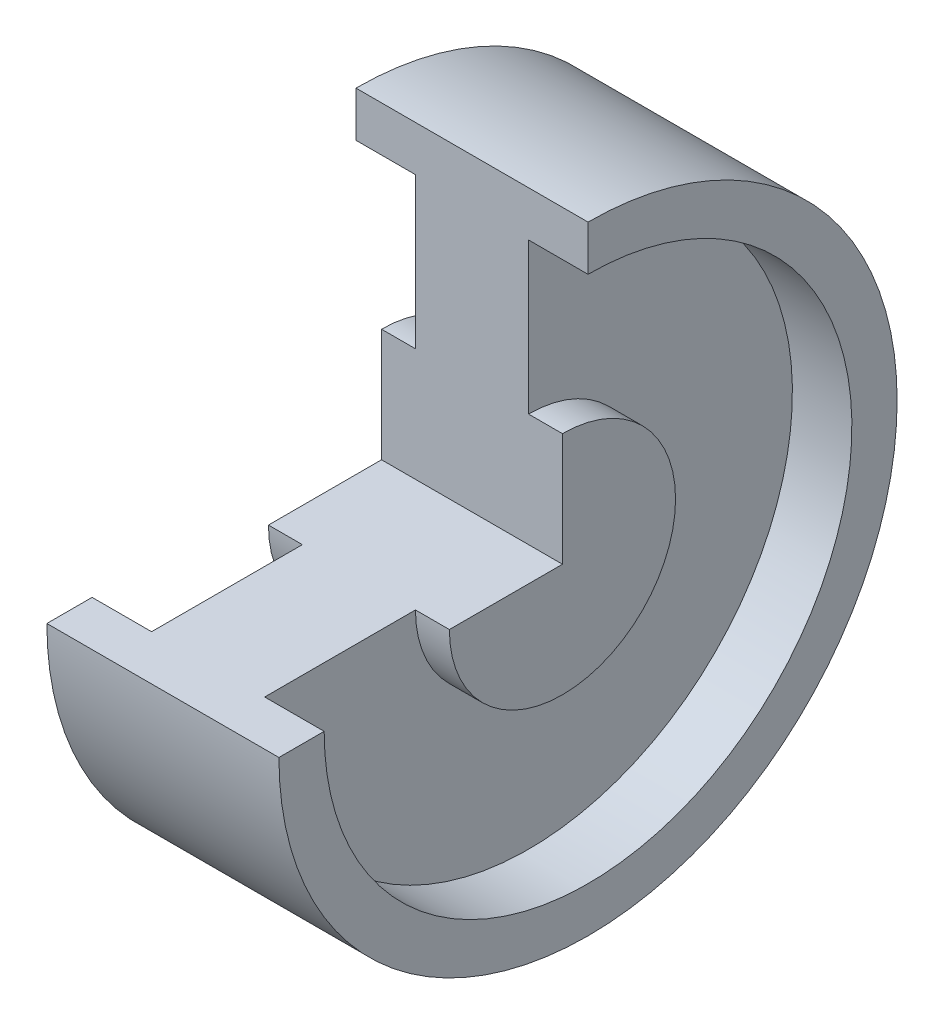
ISO-10303-21;
HEADER;
FILE_DESCRIPTION(('STEP AP214'),'2;1');
FILE_NAME('part.step','',(''),(''),'','','');
FILE_SCHEMA(('AUTOMOTIVE_DESIGN { 1 0 10303 214 1 1 1 1 }'));
ENDSEC;
DATA;
#1=APPLICATION_CONTEXT('core data for automotive mechanical design processes');
#2=APPLICATION_PROTOCOL_DEFINITION('international standard','automotive_design',2000,#1);
#3=PRODUCT_CONTEXT('',#1,'mechanical');
#4=PRODUCT('Part','Part','',(#3));
#5=PRODUCT_RELATED_PRODUCT_CATEGORY('part','',(#4));
#6=PRODUCT_DEFINITION_FORMATION('','',#4);
#7=PRODUCT_DEFINITION_CONTEXT('part definition',#1,'design');
#8=PRODUCT_DEFINITION('design','',#6,#7);
#9=PRODUCT_DEFINITION_SHAPE('','',#8);
#10=(LENGTH_UNIT() NAMED_UNIT(*) SI_UNIT(.MILLI.,.METRE.));
#11=(NAMED_UNIT(*) PLANE_ANGLE_UNIT() SI_UNIT($,.RADIAN.));
#12=(NAMED_UNIT(*) SI_UNIT($,.STERADIAN.) SOLID_ANGLE_UNIT());
#13=UNCERTAINTY_MEASURE_WITH_UNIT(LENGTH_MEASURE(1.E-05),#10,'distance_accuracy_value','');
#14=(GEOMETRIC_REPRESENTATION_CONTEXT(3) GLOBAL_UNCERTAINTY_ASSIGNED_CONTEXT((#13)) GLOBAL_UNIT_ASSIGNED_CONTEXT((#10,
#11,#12)) REPRESENTATION_CONTEXT('',''));
#15=CARTESIAN_POINT('',(0.,0.,0.));
#16=DIRECTION('',(0.,0.,1.));
#17=DIRECTION('',(1.,0.,0.));
#18=AXIS2_PLACEMENT_3D('',#15,#16,#17);
#19=CARTESIAN_POINT('',(31.872847051539,-14.0322601294251,82.));
#20=DIRECTION('',(1.,0.,0.));
#21=DIRECTION('',(0.,1.,0.));
#22=AXIS2_PLACEMENT_3D('',#19,#20,#21);
#23=PLANE('',#22);
#24=CARTESIAN_POINT('',(31.872847051539,-14.032260129426,0.));
#25=DIRECTION('',(1.,0.,0.));
#26=DIRECTION('',(0.,1.,0.));
#27=AXIS2_PLACEMENT_3D('',#24,#25,#26);
#28=CIRCLE('',#27,70.);
#29=CARTESIAN_POINT('',(31.872847051539,-14.0322601294252,70.));
#30=VERTEX_POINT('',#29);
#31=CARTESIAN_POINT('',(31.8728470515389,55.9677398705741,0.));
#32=VERTEX_POINT('',#31);
#33=EDGE_CURVE('E11',#30,#32,#28,.T.);
#34=ORIENTED_EDGE('',*,*,#33,.F.);
#35=DIRECTION('',(0.,0.,1.));
#36=VECTOR('',#35,1.);
#37=CARTESIAN_POINT('',(31.872847051539,-14.0322601294251,82.));
#38=LINE('',#37,#36);
#39=CARTESIAN_POINT('',(31.872847051539,-14.0322601294251,82.));
#40=VERTEX_POINT('',#39);
#41=EDGE_CURVE('E122',#30,#40,#38,.T.);
#42=ORIENTED_EDGE('',*,*,#41,.T.);
#43=CARTESIAN_POINT('',(31.872847051539,-14.032260129426,0.));
#44=DIRECTION('',(1.,0.,0.));
#45=DIRECTION('',(0.,1.,0.));
#46=AXIS2_PLACEMENT_3D('',#43,#44,#45);
#47=CIRCLE('',#46,82.);
#48=CARTESIAN_POINT('',(31.8728470515389,67.9677398705741,0.));
#49=VERTEX_POINT('',#48);
#50=EDGE_CURVE('E117',#40,#49,#47,.T.);
#51=ORIENTED_EDGE('',*,*,#50,.T.);
#52=DIRECTION('',(0.,1.,0.));
#53=VECTOR('',#52,1.);
#54=CARTESIAN_POINT('',(31.8728470515389,67.9677398705741,0.));
#55=LINE('',#54,#53);
#56=EDGE_CURVE('E120',#32,#49,#55,.T.);
#57=ORIENTED_EDGE('',*,*,#56,.F.);
#58=EDGE_LOOP('',(#34,#42,#51,#57));
#59=FACE_BOUND('',#58,.T.);
#60=ADVANCED_FACE('F39',(#59),#23,.T.);
#61=CARTESIAN_POINT('',(25.0922987473726,-14.032260129426,0.));
#62=DIRECTION('',(1.,0.,0.));
#63=DIRECTION('',(0.,1.,0.));
#64=AXIS2_PLACEMENT_3D('',#61,#62,#63);
#65=CYLINDRICAL_SURFACE('',#64,70.);
#66=CARTESIAN_POINT('',(16.0922987473726,-14.032260129426,0.));
#67=DIRECTION('',(1.,0.,0.));
#68=DIRECTION('',(0.,1.,0.));
#69=AXIS2_PLACEMENT_3D('',#66,#67,#68);
#70=CIRCLE('',#69,70.);
#71=CARTESIAN_POINT('',(16.0922987473726,-14.0322601294252,70.));
#72=VERTEX_POINT('',#71);
#73=CARTESIAN_POINT('',(16.0922987473726,55.967739870574,0.));
#74=VERTEX_POINT('',#73);
#75=EDGE_CURVE('E47',#72,#74,#70,.T.);
#76=ORIENTED_EDGE('',*,*,#75,.F.);
#77=DIRECTION('',(1.,0.,0.));
#78=VECTOR('',#77,1.);
#79=CARTESIAN_POINT('',(31.872847051539,-14.0322601294252,70.));
#80=LINE('',#79,#78);
#81=EDGE_CURVE('E127',#72,#30,#80,.T.);
#82=ORIENTED_EDGE('',*,*,#81,.T.);
#83=ORIENTED_EDGE('',*,*,#33,.T.);
#84=DIRECTION('',(1.,0.,0.));
#85=VECTOR('',#84,1.);
#86=CARTESIAN_POINT('',(31.8728470515389,55.9677398705741,0.));
#87=LINE('',#86,#85);
#88=EDGE_CURVE('E140',#74,#32,#87,.T.);
#89=ORIENTED_EDGE('',*,*,#88,.F.);
#90=EDGE_LOOP('',(#76,#82,#83,#89));
#91=FACE_BOUND('',#90,.T.);
#92=ADVANCED_FACE('F41',(#91),#65,.F.);
#93=CARTESIAN_POINT('',(16.0922987473726,-14.0322601294252,70.));
#94=DIRECTION('',(1.,0.,0.));
#95=DIRECTION('',(0.,1.,0.));
#96=AXIS2_PLACEMENT_3D('',#93,#94,#95);
#97=PLANE('',#96);
#98=CARTESIAN_POINT('',(16.0922987473726,-14.032260129426,0.));
#99=DIRECTION('',(1.,0.,0.));
#100=DIRECTION('',(0.,1.,0.));
#101=AXIS2_PLACEMENT_3D('',#98,#99,#100);
#102=CIRCLE('',#101,30.);
#103=CARTESIAN_POINT('',(16.0922987473726,-14.0322601294256,30.));
#104=VERTEX_POINT('',#103);
#105=CARTESIAN_POINT('',(16.0922987473726,15.967739870574,0.));
#106=VERTEX_POINT('',#105);
#107=EDGE_CURVE('E205',#104,#106,#102,.T.);
#108=ORIENTED_EDGE('',*,*,#107,.F.);
#109=DIRECTION('',(0.,0.,1.));
#110=VECTOR('',#109,1.);
#111=CARTESIAN_POINT('',(16.0922987473726,-14.0322601294252,70.));
#112=LINE('',#111,#110);
#113=EDGE_CURVE('E191',#104,#72,#112,.T.);
#114=ORIENTED_EDGE('',*,*,#113,.T.);
#115=ORIENTED_EDGE('',*,*,#75,.T.);
#116=DIRECTION('',(0.,1.,0.));
#117=VECTOR('',#116,1.);
#118=CARTESIAN_POINT('',(16.0922987473726,55.967739870574,0.));
#119=LINE('',#118,#117);
#120=EDGE_CURVE('E161',#106,#74,#119,.T.);
#121=ORIENTED_EDGE('',*,*,#120,.F.);
#122=EDGE_LOOP('',(#108,#114,#115,#121));
#123=FACE_BOUND('',#122,.T.);
#124=ADVANCED_FACE('F208',(#123),#97,.T.);
#125=CARTESIAN_POINT('',(25.0922987473726,-14.032260129426,0.));
#126=DIRECTION('',(1.,0.,0.));
#127=DIRECTION('',(0.,1.,0.));
#128=AXIS2_PLACEMENT_3D('',#125,#126,#127);
#129=CYLINDRICAL_SURFACE('',#128,30.);
#130=CARTESIAN_POINT('',(25.0922987473726,-14.032260129426,0.));
#131=DIRECTION('',(1.,0.,0.));
#132=DIRECTION('',(0.,1.,0.));
#133=AXIS2_PLACEMENT_3D('',#130,#131,#132);
#134=CIRCLE('',#133,30.);
#135=CARTESIAN_POINT('',(25.0922987473726,-14.0322601294256,30.));
#136=VERTEX_POINT('',#135);
#137=CARTESIAN_POINT('',(25.0922987473726,15.967739870574,0.));
#138=VERTEX_POINT('',#137);
#139=EDGE_CURVE('E203',#136,#138,#134,.T.);
#140=ORIENTED_EDGE('',*,*,#139,.F.);
#141=DIRECTION('',(-1.,0.,0.));
#142=VECTOR('',#141,1.);
#143=CARTESIAN_POINT('',(16.0922987473726,-14.0322601294256,30.));
#144=LINE('',#143,#142);
#145=EDGE_CURVE('E188',#136,#104,#144,.T.);
#146=ORIENTED_EDGE('',*,*,#145,.T.);
#147=ORIENTED_EDGE('',*,*,#107,.T.);
#148=DIRECTION('',(-1.,0.,0.));
#149=VECTOR('',#148,1.);
#150=CARTESIAN_POINT('',(16.0922987473726,15.967739870574,0.));
#151=LINE('',#150,#149);
#152=EDGE_CURVE('E158',#138,#106,#151,.T.);
#153=ORIENTED_EDGE('',*,*,#152,.F.);
#154=EDGE_LOOP('',(#140,#146,#147,#153));
#155=FACE_BOUND('',#154,.T.);
#156=ADVANCED_FACE('F239',(#155),#129,.T.);
#157=CARTESIAN_POINT('',(25.0922987473726,-14.0322601294256,30.));
#158=DIRECTION('',(1.,0.,0.));
#159=DIRECTION('',(0.,1.,0.));
#160=AXIS2_PLACEMENT_3D('',#157,#158,#159);
#161=PLANE('',#160);
#162=DIRECTION('',(0.,1.,0.));
#163=VECTOR('',#162,1.);
#164=CARTESIAN_POINT('',(25.0922987473726,15.967739870574,0.));
#165=LINE('',#164,#163);
#166=CARTESIAN_POINT('',(25.0922987473726,-14.032260129426,0.));
#167=VERTEX_POINT('',#166);
#168=EDGE_CURVE('E155',#167,#138,#165,.T.);
#169=ORIENTED_EDGE('',*,*,#168,.F.);
#170=DIRECTION('',(0.,0.,1.));
#171=VECTOR('',#170,1.);
#172=CARTESIAN_POINT('',(25.0922987473726,-14.0322601294256,30.));
#173=LINE('',#172,#171);
#174=EDGE_CURVE('E185',#167,#136,#173,.T.);
#175=ORIENTED_EDGE('',*,*,#174,.T.);
#176=ORIENTED_EDGE('',*,*,#139,.T.);
#177=EDGE_LOOP('',(#169,#175,#176));
#178=FACE_BOUND('',#177,.T.);
#179=ADVANCED_FACE('F237',(#178),#161,.T.);
#180=CARTESIAN_POINT('',(-22.9077012526274,-14.0322601294256,30.));
#181=DIRECTION('',(-1.,0.,0.));
#182=DIRECTION('',(0.,-1.,0.));
#183=AXIS2_PLACEMENT_3D('',#180,#181,#182);
#184=PLANE('',#183);
#185=CARTESIAN_POINT('',(-22.9077012526274,-14.032260129426,0.));
#186=DIRECTION('',(1.,0.,0.));
#187=DIRECTION('',(0.,1.,0.));
#188=AXIS2_PLACEMENT_3D('',#185,#186,#187);
#189=CIRCLE('',#188,30.);
#190=CARTESIAN_POINT('',(-22.9077012526274,-14.0322601294256,30.));
#191=VERTEX_POINT('',#190);
#192=CARTESIAN_POINT('',(-22.9077012526274,15.967739870574,0.));
#193=VERTEX_POINT('',#192);
#194=EDGE_CURVE('E201',#191,#193,#189,.T.);
#195=ORIENTED_EDGE('',*,*,#194,.F.);
#196=DIRECTION('',(0.,0.,-1.));
#197=VECTOR('',#196,1.);
#198=CARTESIAN_POINT('',(-22.9077012526274,-14.0322601294256,30.));
#199=LINE('',#198,#197);
#200=CARTESIAN_POINT('',(-22.9077012526274,-14.032260129426,0.));
#201=VERTEX_POINT('',#200);
#202=EDGE_CURVE('E179',#191,#201,#199,.T.);
#203=ORIENTED_EDGE('',*,*,#202,.T.);
#204=DIRECTION('',(0.,-1.,0.));
#205=VECTOR('',#204,1.);
#206=CARTESIAN_POINT('',(-22.9077012526274,15.967739870574,0.));
#207=LINE('',#206,#205);
#208=EDGE_CURVE('E153',#193,#201,#207,.T.);
#209=ORIENTED_EDGE('',*,*,#208,.F.);
#210=EDGE_LOOP('',(#195,#203,#209));
#211=FACE_BOUND('',#210,.T.);
#212=ADVANCED_FACE('F232',(#211),#184,.T.);
#213=CARTESIAN_POINT('',(25.0922987473726,-14.032260129426,0.));
#214=DIRECTION('',(1.,0.,0.));
#215=DIRECTION('',(0.,1.,0.));
#216=AXIS2_PLACEMENT_3D('',#213,#214,#215);
#217=CYLINDRICAL_SURFACE('',#216,30.);
#218=CARTESIAN_POINT('',(-13.9077012526274,-14.032260129426,0.));
#219=DIRECTION('',(1.,0.,0.));
#220=DIRECTION('',(0.,1.,0.));
#221=AXIS2_PLACEMENT_3D('',#218,#219,#220);
#222=CIRCLE('',#221,30.);
#223=CARTESIAN_POINT('',(-13.9077012526274,-14.0322601294256,30.));
#224=VERTEX_POINT('',#223);
#225=CARTESIAN_POINT('',(-13.9077012526274,15.967739870574,0.));
#226=VERTEX_POINT('',#225);
#227=EDGE_CURVE('E199',#224,#226,#222,.T.);
#228=ORIENTED_EDGE('',*,*,#227,.F.);
#229=DIRECTION('',(-1.,0.,0.));
#230=VECTOR('',#229,1.);
#231=CARTESIAN_POINT('',(-13.9077012526274,-14.0322601294256,30.));
#232=LINE('',#231,#230);
#233=EDGE_CURVE('E176',#224,#191,#232,.T.);
#234=ORIENTED_EDGE('',*,*,#233,.T.);
#235=ORIENTED_EDGE('',*,*,#194,.T.);
#236=DIRECTION('',(-1.,0.,0.));
#237=VECTOR('',#236,1.);
#238=CARTESIAN_POINT('',(-13.9077012526274,15.967739870574,0.));
#239=LINE('',#238,#237);
#240=EDGE_CURVE('E150',#226,#193,#239,.T.);
#241=ORIENTED_EDGE('',*,*,#240,.F.);
#242=EDGE_LOOP('',(#228,#234,#235,#241));
#243=FACE_BOUND('',#242,.T.);
#244=ADVANCED_FACE('F229',(#243),#217,.T.);
#245=CARTESIAN_POINT('',(-13.9077012526274,-14.0322601294252,70.));
#246=DIRECTION('',(-1.,0.,0.));
#247=DIRECTION('',(0.,-1.,0.));
#248=AXIS2_PLACEMENT_3D('',#245,#246,#247);
#249=PLANE('',#248);
#250=CARTESIAN_POINT('',(-13.9077012526274,-14.032260129426,0.));
#251=DIRECTION('',(1.,0.,0.));
#252=DIRECTION('',(0.,1.,0.));
#253=AXIS2_PLACEMENT_3D('',#250,#251,#252);
#254=CIRCLE('',#253,70.);
#255=CARTESIAN_POINT('',(-13.9077012526274,-14.0322601294252,70.));
#256=VERTEX_POINT('',#255);
#257=CARTESIAN_POINT('',(-13.9077012526274,55.967739870574,0.));
#258=VERTEX_POINT('',#257);
#259=EDGE_CURVE('E197',#256,#258,#254,.T.);
#260=ORIENTED_EDGE('',*,*,#259,.F.);
#261=DIRECTION('',(0.,0.,-1.));
#262=VECTOR('',#261,1.);
#263=CARTESIAN_POINT('',(-13.9077012526274,-14.0322601294252,70.));
#264=LINE('',#263,#262);
#265=EDGE_CURVE('E173',#256,#224,#264,.T.);
#266=ORIENTED_EDGE('',*,*,#265,.T.);
#267=ORIENTED_EDGE('',*,*,#227,.T.);
#268=DIRECTION('',(0.,-1.,0.));
#269=VECTOR('',#268,1.);
#270=CARTESIAN_POINT('',(-13.9077012526274,55.967739870574,0.));
#271=LINE('',#270,#269);
#272=EDGE_CURVE('E147',#258,#226,#271,.T.);
#273=ORIENTED_EDGE('',*,*,#272,.F.);
#274=EDGE_LOOP('',(#260,#266,#267,#273));
#275=FACE_BOUND('',#274,.T.);
#276=ADVANCED_FACE('F224',(#275),#249,.T.);
#277=CARTESIAN_POINT('',(25.0922987473726,-14.032260129426,0.));
#278=DIRECTION('',(1.,0.,0.));
#279=DIRECTION('',(0.,1.,0.));
#280=AXIS2_PLACEMENT_3D('',#277,#278,#279);
#281=CYLINDRICAL_SURFACE('',#280,70.);
#282=CARTESIAN_POINT('',(-29.6882495567937,-14.032260129426,0.));
#283=DIRECTION('',(1.,0.,0.));
#284=DIRECTION('',(0.,1.,0.));
#285=AXIS2_PLACEMENT_3D('',#282,#283,#284);
#286=CIRCLE('',#285,70.);
#287=CARTESIAN_POINT('',(-29.6882495567937,-14.0322601294252,70.));
#288=VERTEX_POINT('',#287);
#289=CARTESIAN_POINT('',(-29.6882495567937,55.967739870574,0.));
#290=VERTEX_POINT('',#289);
#291=EDGE_CURVE('E195',#288,#290,#286,.T.);
#292=ORIENTED_EDGE('',*,*,#291,.F.);
#293=DIRECTION('',(1.,0.,0.));
#294=VECTOR('',#293,1.);
#295=CARTESIAN_POINT('',(-29.6882495567937,-14.0322601294252,70.));
#296=LINE('',#295,#294);
#297=EDGE_CURVE('E170',#288,#256,#296,.T.);
#298=ORIENTED_EDGE('',*,*,#297,.T.);
#299=ORIENTED_EDGE('',*,*,#259,.T.);
#300=DIRECTION('',(1.,0.,0.));
#301=VECTOR('',#300,1.);
#302=CARTESIAN_POINT('',(-29.6882495567937,55.967739870574,0.));
#303=LINE('',#302,#301);
#304=EDGE_CURVE('E144',#290,#258,#303,.T.);
#305=ORIENTED_EDGE('',*,*,#304,.F.);
#306=EDGE_LOOP('',(#292,#298,#299,#305));
#307=FACE_BOUND('',#306,.T.);
#308=ADVANCED_FACE('F222',(#307),#281,.F.);
#309=CARTESIAN_POINT('',(-29.6882495567937,-14.0322601294251,82.));
#310=DIRECTION('',(-1.,0.,0.));
#311=DIRECTION('',(0.,-1.,0.));
#312=AXIS2_PLACEMENT_3D('',#309,#310,#311);
#313=PLANE('',#312);
#314=CARTESIAN_POINT('',(-29.6882495567937,-14.032260129426,0.));
#315=DIRECTION('',(1.,0.,0.));
#316=DIRECTION('',(0.,1.,0.));
#317=AXIS2_PLACEMENT_3D('',#314,#315,#316);
#318=CIRCLE('',#317,82.);
#319=CARTESIAN_POINT('',(-29.6882495567937,-14.0322601294251,82.));
#320=VERTEX_POINT('',#319);
#321=CARTESIAN_POINT('',(-29.6882495567937,67.967739870574,0.));
#322=VERTEX_POINT('',#321);
#323=EDGE_CURVE('E126',#320,#322,#318,.T.);
#324=ORIENTED_EDGE('',*,*,#323,.F.);
#325=DIRECTION('',(0.,0.,-1.));
#326=VECTOR('',#325,1.);
#327=CARTESIAN_POINT('',(-29.6882495567937,-14.0322601294251,82.));
#328=LINE('',#327,#326);
#329=EDGE_CURVE('E167',#320,#288,#328,.T.);
#330=ORIENTED_EDGE('',*,*,#329,.T.);
#331=ORIENTED_EDGE('',*,*,#291,.T.);
#332=DIRECTION('',(0.,-1.,0.));
#333=VECTOR('',#332,1.);
#334=CARTESIAN_POINT('',(-29.6882495567937,67.967739870574,0.));
#335=LINE('',#334,#333);
#336=EDGE_CURVE('E135',#322,#290,#335,.T.);
#337=ORIENTED_EDGE('',*,*,#336,.F.);
#338=EDGE_LOOP('',(#324,#330,#331,#337));
#339=FACE_BOUND('',#338,.T.);
#340=ADVANCED_FACE('F218',(#339),#313,.T.);
#341=CARTESIAN_POINT('',(25.0922987473726,-14.032260129426,0.));
#342=DIRECTION('',(1.,0.,0.));
#343=DIRECTION('',(0.,1.,0.));
#344=AXIS2_PLACEMENT_3D('',#341,#342,#343);
#345=CYLINDRICAL_SURFACE('',#344,82.);
#346=DIRECTION('',(-1.,0.,0.));
#347=VECTOR('',#346,1.);
#348=CARTESIAN_POINT('',(-29.6882495567937,-14.0322601294251,82.));
#349=LINE('',#348,#347);
#350=EDGE_CURVE('E165',#40,#320,#349,.T.);
#351=ORIENTED_EDGE('',*,*,#350,.T.);
#352=ORIENTED_EDGE('',*,*,#323,.T.);
#353=DIRECTION('',(-1.,0.,0.));
#354=VECTOR('',#353,1.);
#355=CARTESIAN_POINT('',(-29.6882495567937,67.967739870574,0.));
#356=LINE('',#355,#354);
#357=EDGE_CURVE('E130',#49,#322,#356,.T.);
#358=ORIENTED_EDGE('',*,*,#357,.F.);
#359=ORIENTED_EDGE('',*,*,#50,.F.);
#360=EDGE_LOOP('',(#351,#352,#358,#359));
#361=FACE_BOUND('',#360,.T.);
#362=ADVANCED_FACE('F131',(#361),#345,.T.);
#363=CARTESIAN_POINT('',(0.,-14.0322601294258,14.032260129426));
#364=DIRECTION('',(0.,1.,0.));
#365=DIRECTION('',(-1.,0.,0.));
#366=AXIS2_PLACEMENT_3D('',#363,#364,#365);
#367=PLANE('',#366);
#368=ORIENTED_EDGE('',*,*,#41,.F.);
#369=ORIENTED_EDGE('',*,*,#81,.F.);
#370=ORIENTED_EDGE('',*,*,#113,.F.);
#371=ORIENTED_EDGE('',*,*,#145,.F.);
#372=ORIENTED_EDGE('',*,*,#174,.F.);
#373=DIRECTION('',(1.,0.,0.));
#374=VECTOR('',#373,1.);
#375=CARTESIAN_POINT('',(25.0922987473726,-14.032260129426,0.));
#376=LINE('',#375,#374);
#377=EDGE_CURVE('E182',#201,#167,#376,.T.);
#378=ORIENTED_EDGE('',*,*,#377,.F.);
#379=ORIENTED_EDGE('',*,*,#202,.F.);
#380=ORIENTED_EDGE('',*,*,#233,.F.);
#381=ORIENTED_EDGE('',*,*,#265,.F.);
#382=ORIENTED_EDGE('',*,*,#297,.F.);
#383=ORIENTED_EDGE('',*,*,#329,.F.);
#384=ORIENTED_EDGE('',*,*,#350,.F.);
#385=EDGE_LOOP('',(#368,#369,#370,#371,#372,#378,#379,#380,#381,#382,#383,#384));
#386=FACE_BOUND('',#385,.T.);
#387=ADVANCED_FACE('F213',(#386),#367,.T.);
#388=CARTESIAN_POINT('',(0.,0.,0.));
#389=DIRECTION('',(0.,0.,-1.));
#390=DIRECTION('',(-1.,0.,0.));
#391=AXIS2_PLACEMENT_3D('',#388,#389,#390);
#392=PLANE('',#391);
#393=ORIENTED_EDGE('',*,*,#56,.T.);
#394=ORIENTED_EDGE('',*,*,#357,.T.);
#395=ORIENTED_EDGE('',*,*,#336,.T.);
#396=ORIENTED_EDGE('',*,*,#304,.T.);
#397=ORIENTED_EDGE('',*,*,#272,.T.);
#398=ORIENTED_EDGE('',*,*,#240,.T.);
#399=ORIENTED_EDGE('',*,*,#208,.T.);
#400=ORIENTED_EDGE('',*,*,#377,.T.);
#401=ORIENTED_EDGE('',*,*,#168,.T.);
#402=ORIENTED_EDGE('',*,*,#152,.T.);
#403=ORIENTED_EDGE('',*,*,#120,.T.);
#404=ORIENTED_EDGE('',*,*,#88,.T.);
#405=EDGE_LOOP('',(#393,#394,#395,#396,#397,#398,#399,#400,#401,#402,#403,#404));
#406=FACE_BOUND('',#405,.T.);
#407=ADVANCED_FACE('F138',(#406),#392,.F.);
#408=CLOSED_SHELL('',(#60,#92,#124,#156,#179,#212,#244,#276,#308,#340,#362,#387,#407));
#409=MANIFOLD_SOLID_BREP('B2',#408);
#410=ADVANCED_BREP_SHAPE_REPRESENTATION('',(#18,#409),#14);
#411=SHAPE_DEFINITION_REPRESENTATION(#9,#410);
ENDSEC;
END-ISO-10303-21;
